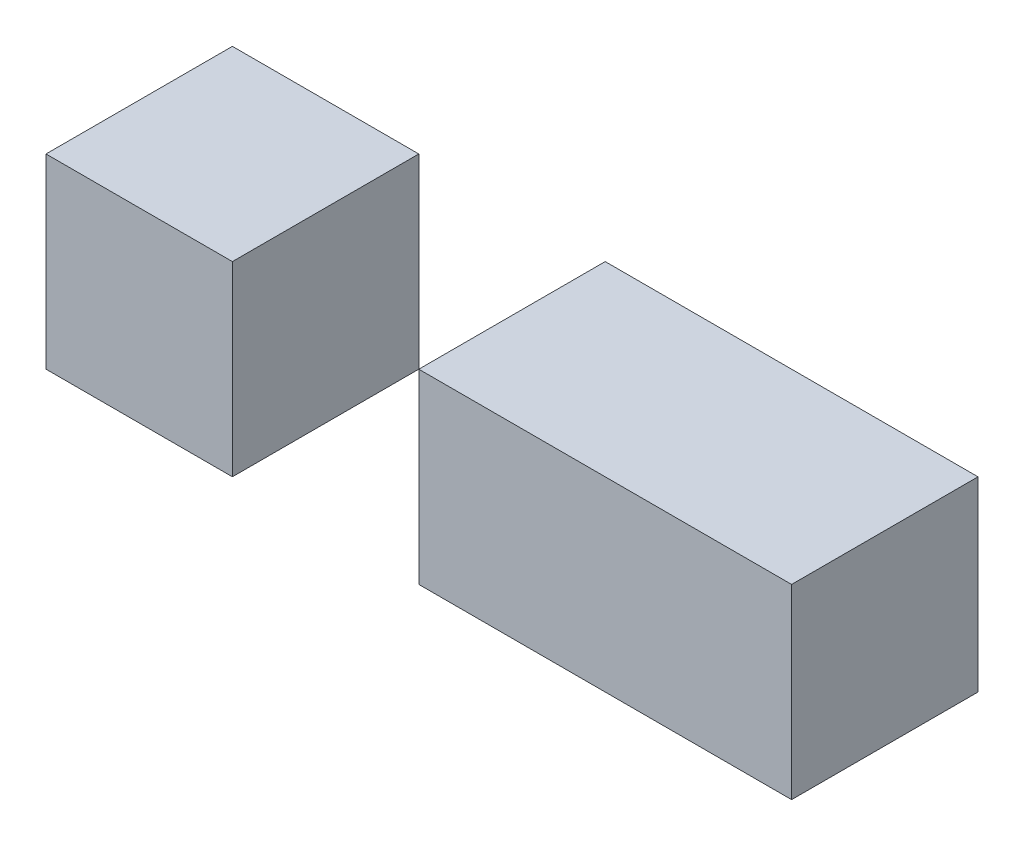
ISO-10303-21;
HEADER;
FILE_DESCRIPTION(('STEP AP214'),'2;1');
FILE_NAME('part.step','',(''),(''),'','','');
FILE_SCHEMA(('AUTOMOTIVE_DESIGN { 1 0 10303 214 1 1 1 1 }'));
ENDSEC;
DATA;
#1=APPLICATION_CONTEXT('core data for automotive mechanical design processes');
#2=APPLICATION_PROTOCOL_DEFINITION('international standard','automotive_design',2000,#1);
#3=PRODUCT_CONTEXT('',#1,'mechanical');
#4=PRODUCT('Part','Part','',(#3));
#5=PRODUCT_RELATED_PRODUCT_CATEGORY('part','',(#4));
#6=PRODUCT_DEFINITION_FORMATION('','',#4);
#7=PRODUCT_DEFINITION_CONTEXT('part definition',#1,'design');
#8=PRODUCT_DEFINITION('design','',#6,#7);
#9=PRODUCT_DEFINITION_SHAPE('','',#8);
#10=(LENGTH_UNIT() NAMED_UNIT(*) SI_UNIT(.MILLI.,.METRE.));
#11=(NAMED_UNIT(*) PLANE_ANGLE_UNIT() SI_UNIT($,.RADIAN.));
#12=(NAMED_UNIT(*) SI_UNIT($,.STERADIAN.) SOLID_ANGLE_UNIT());
#13=UNCERTAINTY_MEASURE_WITH_UNIT(LENGTH_MEASURE(1.E-05),#10,'distance_accuracy_value','');
#14=(GEOMETRIC_REPRESENTATION_CONTEXT(3) GLOBAL_UNCERTAINTY_ASSIGNED_CONTEXT((#13)) GLOBAL_UNIT_ASSIGNED_CONTEXT((#10,
#11,#12)) REPRESENTATION_CONTEXT('',''));
#15=CARTESIAN_POINT('',(0.,0.,0.));
#16=DIRECTION('',(0.,0.,1.));
#17=DIRECTION('',(1.,0.,0.));
#18=AXIS2_PLACEMENT_3D('',#15,#16,#17);
#19=CARTESIAN_POINT('',(0.,0.,10.));
#20=DIRECTION('',(-1.,0.,0.));
#21=DIRECTION('',(0.,0.,1.));
#22=AXIS2_PLACEMENT_3D('',#19,#20,#21);
#23=PLANE('',#22);
#24=DIRECTION('',(0.,1.,0.));
#25=VECTOR('',#24,1.);
#26=CARTESIAN_POINT('',(0.,0.,0.));
#27=LINE('',#26,#25);
#28=CARTESIAN_POINT('',(0.,0.,0.));
#29=VERTEX_POINT('',#28);
#30=CARTESIAN_POINT('',(0.,10.,0.));
#31=VERTEX_POINT('',#30);
#32=EDGE_CURVE('E12',#29,#31,#27,.T.);
#33=ORIENTED_EDGE('',*,*,#32,.F.);
#34=DIRECTION('',(0.,0.,-1.));
#35=VECTOR('',#34,1.);
#36=CARTESIAN_POINT('',(0.,0.,10.));
#37=LINE('',#36,#35);
#38=CARTESIAN_POINT('',(0.,0.,10.));
#39=VERTEX_POINT('',#38);
#40=EDGE_CURVE('E98',#39,#29,#37,.T.);
#41=ORIENTED_EDGE('',*,*,#40,.F.);
#42=DIRECTION('',(0.,1.,0.));
#43=VECTOR('',#42,1.);
#44=CARTESIAN_POINT('',(0.,0.,10.));
#45=LINE('',#44,#43);
#46=CARTESIAN_POINT('',(0.,10.,10.));
#47=VERTEX_POINT('',#46);
#48=EDGE_CURVE('E57',#39,#47,#45,.T.);
#49=ORIENTED_EDGE('',*,*,#48,.T.);
#50=DIRECTION('',(0.,0.,-1.));
#51=VECTOR('',#50,1.);
#52=CARTESIAN_POINT('',(0.,10.,10.));
#53=LINE('',#52,#51);
#54=EDGE_CURVE('E72',#47,#31,#53,.T.);
#55=ORIENTED_EDGE('',*,*,#54,.T.);
#56=EDGE_LOOP('',(#33,#41,#49,#55));
#57=FACE_BOUND('',#56,.T.);
#58=ADVANCED_FACE('F55',(#57),#23,.T.);
#59=CARTESIAN_POINT('',(0.,0.,10.));
#60=DIRECTION('',(0.,1.,0.));
#61=DIRECTION('',(0.,0.,1.));
#62=AXIS2_PLACEMENT_3D('',#59,#60,#61);
#63=PLANE('',#62);
#64=DIRECTION('',(1.,0.,0.));
#65=VECTOR('',#64,1.);
#66=CARTESIAN_POINT('',(0.,0.,0.));
#67=LINE('',#66,#65);
#68=CARTESIAN_POINT('',(10.,0.,0.));
#69=VERTEX_POINT('',#68);
#70=EDGE_CURVE('E101',#29,#69,#67,.T.);
#71=ORIENTED_EDGE('',*,*,#70,.T.);
#72=DIRECTION('',(0.,0.,-1.));
#73=VECTOR('',#72,1.);
#74=CARTESIAN_POINT('',(10.,0.,10.));
#75=LINE('',#74,#73);
#76=CARTESIAN_POINT('',(10.,0.,10.));
#77=VERTEX_POINT('',#76);
#78=EDGE_CURVE('E102',#77,#69,#75,.T.);
#79=ORIENTED_EDGE('',*,*,#78,.F.);
#80=DIRECTION('',(1.,0.,0.));
#81=VECTOR('',#80,1.);
#82=CARTESIAN_POINT('',(0.,0.,10.));
#83=LINE('',#82,#81);
#84=EDGE_CURVE('E116',#39,#77,#83,.T.);
#85=ORIENTED_EDGE('',*,*,#84,.F.);
#86=ORIENTED_EDGE('',*,*,#40,.T.);
#87=EDGE_LOOP('',(#71,#79,#85,#86));
#88=FACE_BOUND('',#87,.T.);
#89=ADVANCED_FACE('F103',(#88),#63,.F.);
#90=CARTESIAN_POINT('',(10.,0.,10.));
#91=DIRECTION('',(-1.,0.,0.));
#92=DIRECTION('',(0.,0.,1.));
#93=AXIS2_PLACEMENT_3D('',#90,#91,#92);
#94=PLANE('',#93);
#95=DIRECTION('',(0.,1.,0.));
#96=VECTOR('',#95,1.);
#97=CARTESIAN_POINT('',(10.,0.,0.));
#98=LINE('',#97,#96);
#99=CARTESIAN_POINT('',(10.,10.,0.));
#100=VERTEX_POINT('',#99);
#101=EDGE_CURVE('E110',#69,#100,#98,.T.);
#102=ORIENTED_EDGE('',*,*,#101,.T.);
#103=DIRECTION('',(0.,0.,-1.));
#104=VECTOR('',#103,1.);
#105=CARTESIAN_POINT('',(10.,10.,10.));
#106=LINE('',#105,#104);
#107=CARTESIAN_POINT('',(10.,10.,10.));
#108=VERTEX_POINT('',#107);
#109=EDGE_CURVE('E114',#108,#100,#106,.T.);
#110=ORIENTED_EDGE('',*,*,#109,.F.);
#111=DIRECTION('',(0.,1.,0.));
#112=VECTOR('',#111,1.);
#113=CARTESIAN_POINT('',(10.,0.,10.));
#114=LINE('',#113,#112);
#115=EDGE_CURVE('E86',#77,#108,#114,.T.);
#116=ORIENTED_EDGE('',*,*,#115,.F.);
#117=ORIENTED_EDGE('',*,*,#78,.T.);
#118=EDGE_LOOP('',(#102,#110,#116,#117));
#119=FACE_BOUND('',#118,.T.);
#120=ADVANCED_FACE('F112',(#119),#94,.F.);
#121=CARTESIAN_POINT('',(0.,10.,10.));
#122=DIRECTION('',(0.,1.,0.));
#123=DIRECTION('',(0.,0.,1.));
#124=AXIS2_PLACEMENT_3D('',#121,#122,#123);
#125=PLANE('',#124);
#126=DIRECTION('',(1.,0.,0.));
#127=VECTOR('',#126,1.);
#128=CARTESIAN_POINT('',(0.,10.,0.));
#129=LINE('',#128,#127);
#130=EDGE_CURVE('E64',#31,#100,#129,.T.);
#131=ORIENTED_EDGE('',*,*,#130,.F.);
#132=ORIENTED_EDGE('',*,*,#54,.F.);
#133=DIRECTION('',(1.,0.,0.));
#134=VECTOR('',#133,1.);
#135=CARTESIAN_POINT('',(0.,10.,10.));
#136=LINE('',#135,#134);
#137=EDGE_CURVE('E121',#47,#108,#136,.T.);
#138=ORIENTED_EDGE('',*,*,#137,.T.);
#139=ORIENTED_EDGE('',*,*,#109,.T.);
#140=EDGE_LOOP('',(#131,#132,#138,#139));
#141=FACE_BOUND('',#140,.T.);
#142=ADVANCED_FACE('F122',(#141),#125,.T.);
#143=CARTESIAN_POINT('',(0.,0.,10.));
#144=DIRECTION('',(0.,0.,-1.));
#145=DIRECTION('',(-1.,0.,0.));
#146=AXIS2_PLACEMENT_3D('',#143,#144,#145);
#147=PLANE('',#146);
#148=ORIENTED_EDGE('',*,*,#48,.F.);
#149=ORIENTED_EDGE('',*,*,#84,.T.);
#150=ORIENTED_EDGE('',*,*,#115,.T.);
#151=ORIENTED_EDGE('',*,*,#137,.F.);
#152=EDGE_LOOP('',(#148,#149,#150,#151));
#153=FACE_BOUND('',#152,.T.);
#154=ADVANCED_FACE('F53',(#153),#147,.F.);
#155=CARTESIAN_POINT('',(0.,0.,0.));
#156=DIRECTION('',(0.,0.,-1.));
#157=DIRECTION('',(-1.,0.,0.));
#158=AXIS2_PLACEMENT_3D('',#155,#156,#157);
#159=PLANE('',#158);
#160=ORIENTED_EDGE('',*,*,#32,.T.);
#161=ORIENTED_EDGE('',*,*,#130,.T.);
#162=ORIENTED_EDGE('',*,*,#101,.F.);
#163=ORIENTED_EDGE('',*,*,#70,.F.);
#164=EDGE_LOOP('',(#160,#161,#162,#163));
#165=FACE_BOUND('',#164,.T.);
#166=ADVANCED_FACE('F113',(#165),#159,.T.);
#167=CLOSED_SHELL('',(#58,#89,#120,#142,#154,#166));
#168=MANIFOLD_SOLID_BREP('B2',#167);
#169=CARTESIAN_POINT('',(20.,0.,10.));
#170=DIRECTION('',(-1.,0.,0.));
#171=DIRECTION('',(0.,0.,1.));
#172=AXIS2_PLACEMENT_3D('',#169,#170,#171);
#173=PLANE('',#172);
#174=DIRECTION('',(0.,1.,0.));
#175=VECTOR('',#174,1.);
#176=CARTESIAN_POINT('',(20.,0.,0.));
#177=LINE('',#176,#175);
#178=CARTESIAN_POINT('',(20.,0.,0.));
#179=VERTEX_POINT('',#178);
#180=CARTESIAN_POINT('',(20.,10.,0.));
#181=VERTEX_POINT('',#180);
#182=EDGE_CURVE('E238',#179,#181,#177,.T.);
#183=ORIENTED_EDGE('',*,*,#182,.F.);
#184=DIRECTION('',(0.,0.,-1.));
#185=VECTOR('',#184,1.);
#186=CARTESIAN_POINT('',(20.,0.,10.));
#187=LINE('',#186,#185);
#188=CARTESIAN_POINT('',(20.,0.,10.));
#189=VERTEX_POINT('',#188);
#190=EDGE_CURVE('E49',#189,#179,#187,.T.);
#191=ORIENTED_EDGE('',*,*,#190,.F.);
#192=DIRECTION('',(0.,1.,0.));
#193=VECTOR('',#192,1.);
#194=CARTESIAN_POINT('',(20.,0.,10.));
#195=LINE('',#194,#193);
#196=CARTESIAN_POINT('',(20.,10.,10.));
#197=VERTEX_POINT('',#196);
#198=EDGE_CURVE('E232',#189,#197,#195,.T.);
#199=ORIENTED_EDGE('',*,*,#198,.T.);
#200=DIRECTION('',(0.,0.,-1.));
#201=VECTOR('',#200,1.);
#202=CARTESIAN_POINT('',(20.,10.,10.));
#203=LINE('',#202,#201);
#204=EDGE_CURVE('E180',#197,#181,#203,.T.);
#205=ORIENTED_EDGE('',*,*,#204,.T.);
#206=EDGE_LOOP('',(#183,#191,#199,#205));
#207=FACE_BOUND('',#206,.T.);
#208=ADVANCED_FACE('F171',(#207),#173,.T.);
#209=CARTESIAN_POINT('',(20.,0.,10.));
#210=DIRECTION('',(0.,1.,0.));
#211=DIRECTION('',(0.,0.,1.));
#212=AXIS2_PLACEMENT_3D('',#209,#210,#211);
#213=PLANE('',#212);
#214=DIRECTION('',(1.,0.,0.));
#215=VECTOR('',#214,1.);
#216=CARTESIAN_POINT('',(20.,0.,0.));
#217=LINE('',#216,#215);
#218=CARTESIAN_POINT('',(40.,0.,0.));
#219=VERTEX_POINT('',#218);
#220=EDGE_CURVE('E208',#179,#219,#217,.T.);
#221=ORIENTED_EDGE('',*,*,#220,.T.);
#222=DIRECTION('',(0.,0.,-1.));
#223=VECTOR('',#222,1.);
#224=CARTESIAN_POINT('',(40.,0.,10.));
#225=LINE('',#224,#223);
#226=CARTESIAN_POINT('',(40.,0.,10.));
#227=VERTEX_POINT('',#226);
#228=EDGE_CURVE('E184',#227,#219,#225,.T.);
#229=ORIENTED_EDGE('',*,*,#228,.F.);
#230=DIRECTION('',(1.,0.,0.));
#231=VECTOR('',#230,1.);
#232=CARTESIAN_POINT('',(20.,0.,10.));
#233=LINE('',#232,#231);
#234=EDGE_CURVE('E223',#189,#227,#233,.T.);
#235=ORIENTED_EDGE('',*,*,#234,.F.);
#236=ORIENTED_EDGE('',*,*,#190,.T.);
#237=EDGE_LOOP('',(#221,#229,#235,#236));
#238=FACE_BOUND('',#237,.T.);
#239=ADVANCED_FACE('F248',(#238),#213,.F.);
#240=CARTESIAN_POINT('',(40.,0.,10.));
#241=DIRECTION('',(-1.,0.,0.));
#242=DIRECTION('',(0.,0.,1.));
#243=AXIS2_PLACEMENT_3D('',#240,#241,#242);
#244=PLANE('',#243);
#245=DIRECTION('',(0.,1.,0.));
#246=VECTOR('',#245,1.);
#247=CARTESIAN_POINT('',(40.,0.,0.));
#248=LINE('',#247,#246);
#249=CARTESIAN_POINT('',(40.,10.,0.));
#250=VERTEX_POINT('',#249);
#251=EDGE_CURVE('E231',#219,#250,#248,.T.);
#252=ORIENTED_EDGE('',*,*,#251,.T.);
#253=DIRECTION('',(0.,0.,-1.));
#254=VECTOR('',#253,1.);
#255=CARTESIAN_POINT('',(40.,10.,10.));
#256=LINE('',#255,#254);
#257=CARTESIAN_POINT('',(40.,10.,10.));
#258=VERTEX_POINT('',#257);
#259=EDGE_CURVE('E230',#258,#250,#256,.T.);
#260=ORIENTED_EDGE('',*,*,#259,.F.);
#261=DIRECTION('',(0.,1.,0.));
#262=VECTOR('',#261,1.);
#263=CARTESIAN_POINT('',(40.,0.,10.));
#264=LINE('',#263,#262);
#265=EDGE_CURVE('E219',#227,#258,#264,.T.);
#266=ORIENTED_EDGE('',*,*,#265,.F.);
#267=ORIENTED_EDGE('',*,*,#228,.T.);
#268=EDGE_LOOP('',(#252,#260,#266,#267));
#269=FACE_BOUND('',#268,.T.);
#270=ADVANCED_FACE('F226',(#269),#244,.F.);
#271=CARTESIAN_POINT('',(20.,10.,10.));
#272=DIRECTION('',(0.,1.,0.));
#273=DIRECTION('',(0.,0.,1.));
#274=AXIS2_PLACEMENT_3D('',#271,#272,#273);
#275=PLANE('',#274);
#276=DIRECTION('',(1.,0.,0.));
#277=VECTOR('',#276,1.);
#278=CARTESIAN_POINT('',(20.,10.,0.));
#279=LINE('',#278,#277);
#280=EDGE_CURVE('E242',#181,#250,#279,.T.);
#281=ORIENTED_EDGE('',*,*,#280,.F.);
#282=ORIENTED_EDGE('',*,*,#204,.F.);
#283=DIRECTION('',(1.,0.,0.));
#284=VECTOR('',#283,1.);
#285=CARTESIAN_POINT('',(20.,10.,10.));
#286=LINE('',#285,#284);
#287=EDGE_CURVE('E221',#197,#258,#286,.T.);
#288=ORIENTED_EDGE('',*,*,#287,.T.);
#289=ORIENTED_EDGE('',*,*,#259,.T.);
#290=EDGE_LOOP('',(#281,#282,#288,#289));
#291=FACE_BOUND('',#290,.T.);
#292=ADVANCED_FACE('F233',(#291),#275,.T.);
#293=CARTESIAN_POINT('',(0.,0.,10.));
#294=DIRECTION('',(0.,0.,-1.));
#295=DIRECTION('',(-1.,0.,0.));
#296=AXIS2_PLACEMENT_3D('',#293,#294,#295);
#297=PLANE('',#296);
#298=ORIENTED_EDGE('',*,*,#198,.F.);
#299=ORIENTED_EDGE('',*,*,#234,.T.);
#300=ORIENTED_EDGE('',*,*,#265,.T.);
#301=ORIENTED_EDGE('',*,*,#287,.F.);
#302=EDGE_LOOP('',(#298,#299,#300,#301));
#303=FACE_BOUND('',#302,.T.);
#304=ADVANCED_FACE('F224',(#303),#297,.F.);
#305=CARTESIAN_POINT('',(0.,0.,0.));
#306=DIRECTION('',(0.,0.,-1.));
#307=DIRECTION('',(-1.,0.,0.));
#308=AXIS2_PLACEMENT_3D('',#305,#306,#307);
#309=PLANE('',#308);
#310=ORIENTED_EDGE('',*,*,#182,.T.);
#311=ORIENTED_EDGE('',*,*,#280,.T.);
#312=ORIENTED_EDGE('',*,*,#251,.F.);
#313=ORIENTED_EDGE('',*,*,#220,.F.);
#314=EDGE_LOOP('',(#310,#311,#312,#313));
#315=FACE_BOUND('',#314,.T.);
#316=ADVANCED_FACE('F249',(#315),#309,.T.);
#317=CLOSED_SHELL('',(#208,#239,#270,#292,#304,#316));
#318=MANIFOLD_SOLID_BREP('B6',#317);
#319=ADVANCED_BREP_SHAPE_REPRESENTATION('',(#18,#168,#318),#14);
#320=SHAPE_DEFINITION_REPRESENTATION(#9,#319);
ENDSEC;
END-ISO-10303-21;
